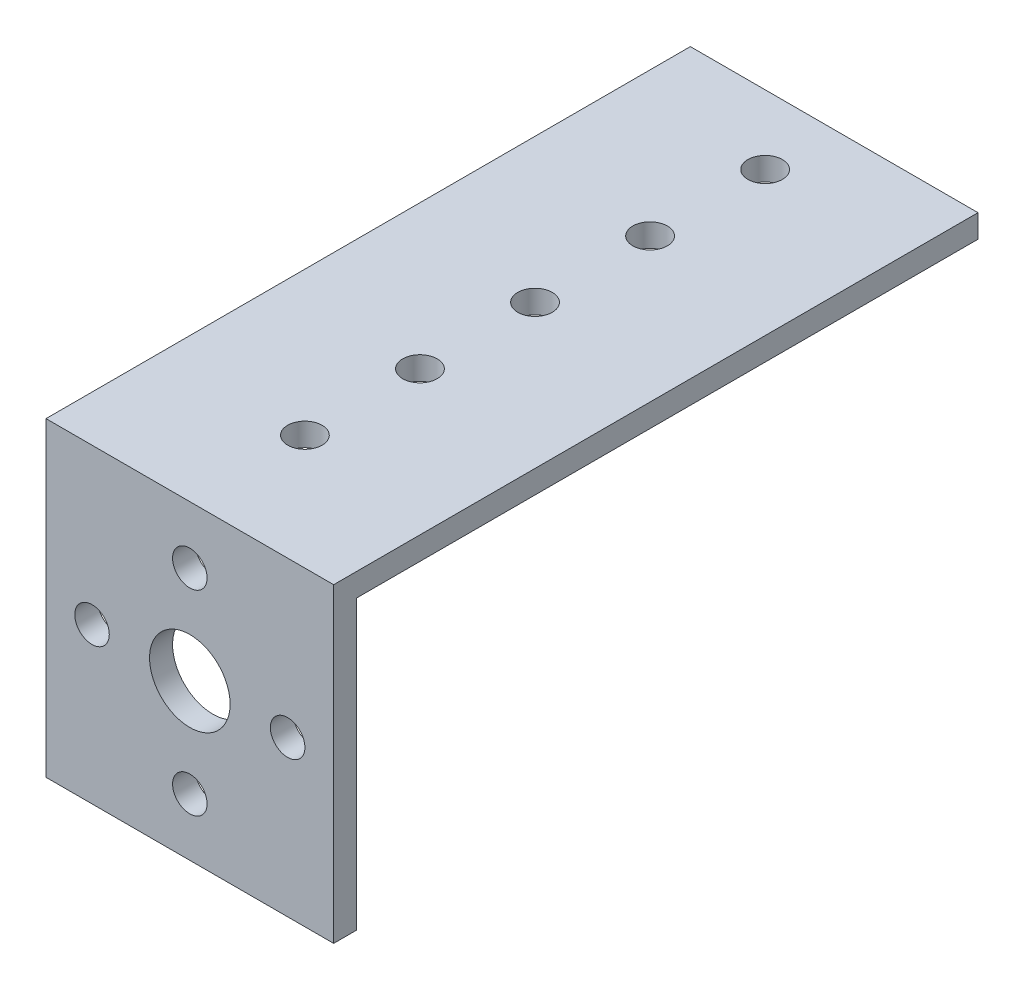
ISO-10303-21;
HEADER;
FILE_DESCRIPTION(('STEP AP214'),'2;1');
FILE_NAME('part.step','',(''),(''),'','','');
FILE_SCHEMA(('AUTOMOTIVE_DESIGN { 1 0 10303 214 1 1 1 1 }'));
ENDSEC;
DATA;
#1=APPLICATION_CONTEXT('core data for automotive mechanical design processes');
#2=APPLICATION_PROTOCOL_DEFINITION('international standard','automotive_design',2000,#1);
#3=PRODUCT_CONTEXT('',#1,'mechanical');
#4=PRODUCT('Part','Part','',(#3));
#5=PRODUCT_RELATED_PRODUCT_CATEGORY('part','',(#4));
#6=PRODUCT_DEFINITION_FORMATION('','',#4);
#7=PRODUCT_DEFINITION_CONTEXT('part definition',#1,'design');
#8=PRODUCT_DEFINITION('design','',#6,#7);
#9=PRODUCT_DEFINITION_SHAPE('','',#8);
#10=(LENGTH_UNIT() NAMED_UNIT(*) SI_UNIT(.MILLI.,.METRE.));
#11=(NAMED_UNIT(*) PLANE_ANGLE_UNIT() SI_UNIT($,.RADIAN.));
#12=(NAMED_UNIT(*) SI_UNIT($,.STERADIAN.) SOLID_ANGLE_UNIT());
#13=UNCERTAINTY_MEASURE_WITH_UNIT(LENGTH_MEASURE(1.E-05),#10,'distance_accuracy_value','');
#14=(GEOMETRIC_REPRESENTATION_CONTEXT(3) GLOBAL_UNCERTAINTY_ASSIGNED_CONTEXT((#13)) GLOBAL_UNIT_ASSIGNED_CONTEXT((#10,
#11,#12)) REPRESENTATION_CONTEXT('',''));
#15=CARTESIAN_POINT('',(0.,0.,0.));
#16=DIRECTION('',(0.,0.,1.));
#17=DIRECTION('',(1.,0.,0.));
#18=AXIS2_PLACEMENT_3D('',#15,#16,#17);
#19=CARTESIAN_POINT('',(25.,0.,-2.));
#20=DIRECTION('',(0.,1.,0.));
#21=DIRECTION('',(0.,0.,1.));
#22=AXIS2_PLACEMENT_3D('',#19,#20,#21);
#23=PLANE('',#22);
#24=DIRECTION('',(0.,0.,-1.));
#25=VECTOR('',#24,1.);
#26=CARTESIAN_POINT('',(0.,0.,-2.));
#27=LINE('',#26,#25);
#28=CARTESIAN_POINT('',(0.,0.,0.));
#29=VERTEX_POINT('',#28);
#30=CARTESIAN_POINT('',(0.,0.,-2.));
#31=VERTEX_POINT('',#30);
#32=EDGE_CURVE('E129',#29,#31,#27,.T.);
#33=ORIENTED_EDGE('',*,*,#32,.T.);
#34=DIRECTION('',(-1.,0.,0.));
#35=VECTOR('',#34,1.);
#36=CARTESIAN_POINT('',(25.,0.,-2.));
#37=LINE('',#36,#35);
#38=CARTESIAN_POINT('',(25.,0.,-2.));
#39=VERTEX_POINT('',#38);
#40=EDGE_CURVE('E11',#39,#31,#37,.T.);
#41=ORIENTED_EDGE('',*,*,#40,.F.);
#42=DIRECTION('',(0.,0.,-1.));
#43=VECTOR('',#42,1.);
#44=CARTESIAN_POINT('',(25.,0.,-2.));
#45=LINE('',#44,#43);
#46=CARTESIAN_POINT('',(25.,0.,0.));
#47=VERTEX_POINT('',#46);
#48=EDGE_CURVE('E140',#47,#39,#45,.T.);
#49=ORIENTED_EDGE('',*,*,#48,.F.);
#50=DIRECTION('',(-1.,0.,0.));
#51=VECTOR('',#50,1.);
#52=CARTESIAN_POINT('',(25.,0.,0.));
#53=LINE('',#52,#51);
#54=EDGE_CURVE('E125',#47,#29,#53,.T.);
#55=ORIENTED_EDGE('',*,*,#54,.T.);
#56=EDGE_LOOP('',(#33,#41,#49,#55));
#57=FACE_BOUND('',#56,.T.);
#58=ADVANCED_FACE('F45',(#57),#23,.F.);
#59=CARTESIAN_POINT('',(25.,25.,-2.));
#60=DIRECTION('',(0.,0.,1.));
#61=DIRECTION('',(0.,-1.,0.));
#62=AXIS2_PLACEMENT_3D('',#59,#60,#61);
#63=PLANE('',#62);
#64=CARTESIAN_POINT('',(12.5,22.,-2.));
#65=DIRECTION('',(0.,0.,1.));
#66=DIRECTION('',(0.,-1.,0.));
#67=AXIS2_PLACEMENT_3D('',#64,#65,#66);
#68=CIRCLE('',#67,1.5);
#69=CARTESIAN_POINT('',(12.5,20.5,-2.));
#70=VERTEX_POINT('',#69);
#71=EDGE_CURVE('E133',#70,#70,#68,.T.);
#72=ORIENTED_EDGE('',*,*,#71,.T.);
#73=EDGE_LOOP('',(#72));
#74=FACE_BOUND('',#73,.T.);
#75=CARTESIAN_POINT('',(12.5,5.00000000000001,-2.));
#76=DIRECTION('',(0.,0.,1.));
#77=DIRECTION('',(0.,-1.,0.));
#78=AXIS2_PLACEMENT_3D('',#75,#76,#77);
#79=CIRCLE('',#78,1.5);
#80=CARTESIAN_POINT('',(12.5,3.50000000000001,-2.));
#81=VERTEX_POINT('',#80);
#82=EDGE_CURVE('E315',#81,#81,#79,.T.);
#83=ORIENTED_EDGE('',*,*,#82,.T.);
#84=EDGE_LOOP('',(#83));
#85=FACE_BOUND('',#84,.T.);
#86=CARTESIAN_POINT('',(21.,13.5,-2.));
#87=DIRECTION('',(0.,0.,1.));
#88=DIRECTION('',(0.,-1.,0.));
#89=AXIS2_PLACEMENT_3D('',#86,#87,#88);
#90=CIRCLE('',#89,1.5);
#91=CARTESIAN_POINT('',(21.,12.,-2.));
#92=VERTEX_POINT('',#91);
#93=EDGE_CURVE('E312',#92,#92,#90,.T.);
#94=ORIENTED_EDGE('',*,*,#93,.T.);
#95=EDGE_LOOP('',(#94));
#96=FACE_BOUND('',#95,.T.);
#97=CARTESIAN_POINT('',(12.5,13.5,-2.));
#98=DIRECTION('',(0.,0.,1.));
#99=DIRECTION('',(0.,-1.,0.));
#100=AXIS2_PLACEMENT_3D('',#97,#98,#99);
#101=CIRCLE('',#100,3.5);
#102=CARTESIAN_POINT('',(12.5,10.,-2.));
#103=VERTEX_POINT('',#102);
#104=EDGE_CURVE('E309',#103,#103,#101,.T.);
#105=ORIENTED_EDGE('',*,*,#104,.T.);
#106=EDGE_LOOP('',(#105));
#107=FACE_BOUND('',#106,.T.);
#108=CARTESIAN_POINT('',(4.,13.5,-2.));
#109=DIRECTION('',(0.,0.,1.));
#110=DIRECTION('',(0.,-1.,0.));
#111=AXIS2_PLACEMENT_3D('',#108,#109,#110);
#112=CIRCLE('',#111,1.5);
#113=CARTESIAN_POINT('',(4.,12.,-2.));
#114=VERTEX_POINT('',#113);
#115=EDGE_CURVE('E298',#114,#114,#112,.T.);
#116=ORIENTED_EDGE('',*,*,#115,.T.);
#117=EDGE_LOOP('',(#116));
#118=FACE_BOUND('',#117,.T.);
#119=DIRECTION('',(0.,1.,0.));
#120=VECTOR('',#119,1.);
#121=CARTESIAN_POINT('',(0.,25.,-2.));
#122=LINE('',#121,#120);
#123=CARTESIAN_POINT('',(0.,25.,-2.));
#124=VERTEX_POINT('',#123);
#125=EDGE_CURVE('E132',#31,#124,#122,.T.);
#126=ORIENTED_EDGE('',*,*,#125,.T.);
#127=DIRECTION('',(-1.,0.,0.));
#128=VECTOR('',#127,1.);
#129=CARTESIAN_POINT('',(25.,25.,-2.));
#130=LINE('',#129,#128);
#131=CARTESIAN_POINT('',(25.,25.,-2.));
#132=VERTEX_POINT('',#131);
#133=EDGE_CURVE('E53',#132,#124,#130,.T.);
#134=ORIENTED_EDGE('',*,*,#133,.F.);
#135=DIRECTION('',(0.,1.,0.));
#136=VECTOR('',#135,1.);
#137=CARTESIAN_POINT('',(25.,25.,-2.));
#138=LINE('',#137,#136);
#139=EDGE_CURVE('E98',#39,#132,#138,.T.);
#140=ORIENTED_EDGE('',*,*,#139,.F.);
#141=ORIENTED_EDGE('',*,*,#40,.T.);
#142=EDGE_LOOP('',(#126,#134,#140,#141));
#143=FACE_BOUND('',#142,.T.);
#144=ADVANCED_FACE('F170',(#74,#85,#96,#107,#118,#143),#63,.F.);
#145=CARTESIAN_POINT('',(25.,25.,-56.));
#146=DIRECTION('',(0.,1.,0.));
#147=DIRECTION('',(0.,0.,1.));
#148=AXIS2_PLACEMENT_3D('',#145,#146,#147);
#149=PLANE('',#148);
#150=CARTESIAN_POINT('',(12.5,25.,-10.));
#151=DIRECTION('',(0.,1.,0.));
#152=DIRECTION('',(0.,0.,1.));
#153=AXIS2_PLACEMENT_3D('',#150,#151,#152);
#154=CIRCLE('',#153,1.5);
#155=CARTESIAN_POINT('',(12.5,25.,-8.5));
#156=VERTEX_POINT('',#155);
#157=EDGE_CURVE('E283',#156,#156,#154,.T.);
#158=ORIENTED_EDGE('',*,*,#157,.T.);
#159=EDGE_LOOP('',(#158));
#160=FACE_BOUND('',#159,.T.);
#161=CARTESIAN_POINT('',(12.5,25.,-20.));
#162=DIRECTION('',(0.,1.,0.));
#163=DIRECTION('',(0.,0.,1.));
#164=AXIS2_PLACEMENT_3D('',#161,#162,#163);
#165=CIRCLE('',#164,1.5);
#166=CARTESIAN_POINT('',(12.5,25.,-18.5));
#167=VERTEX_POINT('',#166);
#168=EDGE_CURVE('E285',#167,#167,#165,.T.);
#169=ORIENTED_EDGE('',*,*,#168,.T.);
#170=EDGE_LOOP('',(#169));
#171=FACE_BOUND('',#170,.T.);
#172=CARTESIAN_POINT('',(12.5,25.,-30.));
#173=DIRECTION('',(0.,1.,0.));
#174=DIRECTION('',(0.,0.,1.));
#175=AXIS2_PLACEMENT_3D('',#172,#173,#174);
#176=CIRCLE('',#175,1.5);
#177=CARTESIAN_POINT('',(12.5,25.,-28.5));
#178=VERTEX_POINT('',#177);
#179=EDGE_CURVE('E291',#178,#178,#176,.T.);
#180=ORIENTED_EDGE('',*,*,#179,.T.);
#181=EDGE_LOOP('',(#180));
#182=FACE_BOUND('',#181,.T.);
#183=CARTESIAN_POINT('',(12.5,25.,-40.));
#184=DIRECTION('',(0.,1.,0.));
#185=DIRECTION('',(0.,0.,1.));
#186=AXIS2_PLACEMENT_3D('',#183,#184,#185);
#187=CIRCLE('',#186,1.5);
#188=CARTESIAN_POINT('',(12.5,25.,-38.5));
#189=VERTEX_POINT('',#188);
#190=EDGE_CURVE('E341',#189,#189,#187,.T.);
#191=ORIENTED_EDGE('',*,*,#190,.T.);
#192=EDGE_LOOP('',(#191));
#193=FACE_BOUND('',#192,.T.);
#194=CARTESIAN_POINT('',(12.5,25.,-50.));
#195=DIRECTION('',(0.,1.,0.));
#196=DIRECTION('',(0.,0.,1.));
#197=AXIS2_PLACEMENT_3D('',#194,#195,#196);
#198=CIRCLE('',#197,1.5);
#199=CARTESIAN_POINT('',(12.5,25.,-48.5));
#200=VERTEX_POINT('',#199);
#201=EDGE_CURVE('E344',#200,#200,#198,.T.);
#202=ORIENTED_EDGE('',*,*,#201,.T.);
#203=EDGE_LOOP('',(#202));
#204=FACE_BOUND('',#203,.T.);
#205=DIRECTION('',(0.,0.,-1.));
#206=VECTOR('',#205,1.);
#207=CARTESIAN_POINT('',(0.,25.,-56.));
#208=LINE('',#207,#206);
#209=CARTESIAN_POINT('',(0.,25.,-56.));
#210=VERTEX_POINT('',#209);
#211=EDGE_CURVE('E135',#124,#210,#208,.T.);
#212=ORIENTED_EDGE('',*,*,#211,.T.);
#213=DIRECTION('',(-1.,0.,0.));
#214=VECTOR('',#213,1.);
#215=CARTESIAN_POINT('',(25.,25.,-56.));
#216=LINE('',#215,#214);
#217=CARTESIAN_POINT('',(25.,25.,-56.));
#218=VERTEX_POINT('',#217);
#219=EDGE_CURVE('E120',#218,#210,#216,.T.);
#220=ORIENTED_EDGE('',*,*,#219,.F.);
#221=DIRECTION('',(0.,0.,-1.));
#222=VECTOR('',#221,1.);
#223=CARTESIAN_POINT('',(25.,25.,-56.));
#224=LINE('',#223,#222);
#225=EDGE_CURVE('E111',#132,#218,#224,.T.);
#226=ORIENTED_EDGE('',*,*,#225,.F.);
#227=ORIENTED_EDGE('',*,*,#133,.T.);
#228=EDGE_LOOP('',(#212,#220,#226,#227));
#229=FACE_BOUND('',#228,.T.);
#230=ADVANCED_FACE('F146',(#160,#171,#182,#193,#204,#229),#149,.F.);
#231=CARTESIAN_POINT('',(25.,27.,-56.));
#232=DIRECTION('',(0.,0.,1.));
#233=DIRECTION('',(1.,0.,0.));
#234=AXIS2_PLACEMENT_3D('',#231,#232,#233);
#235=PLANE('',#234);
#236=DIRECTION('',(0.,1.,0.));
#237=VECTOR('',#236,1.);
#238=CARTESIAN_POINT('',(0.,27.,-56.));
#239=LINE('',#238,#237);
#240=CARTESIAN_POINT('',(0.,27.,-56.));
#241=VERTEX_POINT('',#240);
#242=EDGE_CURVE('E119',#210,#241,#239,.T.);
#243=ORIENTED_EDGE('',*,*,#242,.T.);
#244=DIRECTION('',(-1.,0.,0.));
#245=VECTOR('',#244,1.);
#246=CARTESIAN_POINT('',(25.,27.,-56.));
#247=LINE('',#246,#245);
#248=CARTESIAN_POINT('',(25.,27.,-56.));
#249=VERTEX_POINT('',#248);
#250=EDGE_CURVE('E116',#249,#241,#247,.T.);
#251=ORIENTED_EDGE('',*,*,#250,.F.);
#252=DIRECTION('',(0.,1.,0.));
#253=VECTOR('',#252,1.);
#254=CARTESIAN_POINT('',(25.,27.,-56.));
#255=LINE('',#254,#253);
#256=EDGE_CURVE('E105',#218,#249,#255,.T.);
#257=ORIENTED_EDGE('',*,*,#256,.F.);
#258=ORIENTED_EDGE('',*,*,#219,.T.);
#259=EDGE_LOOP('',(#243,#251,#257,#258));
#260=FACE_BOUND('',#259,.T.);
#261=ADVANCED_FACE('F117',(#260),#235,.F.);
#262=CARTESIAN_POINT('',(25.,27.,0.));
#263=DIRECTION('',(0.,-1.,0.));
#264=DIRECTION('',(0.,0.,-1.));
#265=AXIS2_PLACEMENT_3D('',#262,#263,#264);
#266=PLANE('',#265);
#267=CARTESIAN_POINT('',(12.5,27.,-10.));
#268=DIRECTION('',(0.,1.,0.));
#269=DIRECTION('',(0.,0.,1.));
#270=AXIS2_PLACEMENT_3D('',#267,#268,#269);
#271=CIRCLE('',#270,1.5);
#272=CARTESIAN_POINT('',(12.5,27.,-8.5));
#273=VERTEX_POINT('',#272);
#274=EDGE_CURVE('E280',#273,#273,#271,.T.);
#275=ORIENTED_EDGE('',*,*,#274,.F.);
#276=EDGE_LOOP('',(#275));
#277=FACE_BOUND('',#276,.T.);
#278=CARTESIAN_POINT('',(12.5,27.,-20.));
#279=DIRECTION('',(0.,1.,0.));
#280=DIRECTION('',(0.,0.,1.));
#281=AXIS2_PLACEMENT_3D('',#278,#279,#280);
#282=CIRCLE('',#281,1.5);
#283=CARTESIAN_POINT('',(12.5,27.,-18.5));
#284=VERTEX_POINT('',#283);
#285=EDGE_CURVE('E356',#284,#284,#282,.T.);
#286=ORIENTED_EDGE('',*,*,#285,.F.);
#287=EDGE_LOOP('',(#286));
#288=FACE_BOUND('',#287,.T.);
#289=CARTESIAN_POINT('',(12.5,27.,-30.));
#290=DIRECTION('',(0.,1.,0.));
#291=DIRECTION('',(0.,0.,1.));
#292=AXIS2_PLACEMENT_3D('',#289,#290,#291);
#293=CIRCLE('',#292,1.5);
#294=CARTESIAN_POINT('',(12.5,27.,-28.5));
#295=VERTEX_POINT('',#294);
#296=EDGE_CURVE('E353',#295,#295,#293,.T.);
#297=ORIENTED_EDGE('',*,*,#296,.F.);
#298=EDGE_LOOP('',(#297));
#299=FACE_BOUND('',#298,.T.);
#300=CARTESIAN_POINT('',(12.5,27.,-40.));
#301=DIRECTION('',(0.,1.,0.));
#302=DIRECTION('',(0.,0.,1.));
#303=AXIS2_PLACEMENT_3D('',#300,#301,#302);
#304=CIRCLE('',#303,1.5);
#305=CARTESIAN_POINT('',(12.5,27.,-38.5));
#306=VERTEX_POINT('',#305);
#307=EDGE_CURVE('E350',#306,#306,#304,.T.);
#308=ORIENTED_EDGE('',*,*,#307,.F.);
#309=EDGE_LOOP('',(#308));
#310=FACE_BOUND('',#309,.T.);
#311=CARTESIAN_POINT('',(12.5,27.,-50.));
#312=DIRECTION('',(0.,1.,0.));
#313=DIRECTION('',(0.,0.,1.));
#314=AXIS2_PLACEMENT_3D('',#311,#312,#313);
#315=CIRCLE('',#314,1.5);
#316=CARTESIAN_POINT('',(12.5,27.,-48.5));
#317=VERTEX_POINT('',#316);
#318=EDGE_CURVE('E347',#317,#317,#315,.T.);
#319=ORIENTED_EDGE('',*,*,#318,.F.);
#320=EDGE_LOOP('',(#319));
#321=FACE_BOUND('',#320,.T.);
#322=DIRECTION('',(0.,0.,1.));
#323=VECTOR('',#322,1.);
#324=CARTESIAN_POINT('',(0.,27.,0.));
#325=LINE('',#324,#323);
#326=CARTESIAN_POINT('',(0.,27.,0.));
#327=VERTEX_POINT('',#326);
#328=EDGE_CURVE('E84',#241,#327,#325,.T.);
#329=ORIENTED_EDGE('',*,*,#328,.T.);
#330=DIRECTION('',(-1.,0.,0.));
#331=VECTOR('',#330,1.);
#332=CARTESIAN_POINT('',(25.,27.,0.));
#333=LINE('',#332,#331);
#334=CARTESIAN_POINT('',(25.,27.,0.));
#335=VERTEX_POINT('',#334);
#336=EDGE_CURVE('E121',#335,#327,#333,.T.);
#337=ORIENTED_EDGE('',*,*,#336,.F.);
#338=DIRECTION('',(0.,0.,1.));
#339=VECTOR('',#338,1.);
#340=CARTESIAN_POINT('',(25.,27.,0.));
#341=LINE('',#340,#339);
#342=EDGE_CURVE('E109',#249,#335,#341,.T.);
#343=ORIENTED_EDGE('',*,*,#342,.F.);
#344=ORIENTED_EDGE('',*,*,#250,.T.);
#345=EDGE_LOOP('',(#329,#337,#343,#344));
#346=FACE_BOUND('',#345,.T.);
#347=ADVANCED_FACE('F123',(#277,#288,#299,#310,#321,#346),#266,.F.);
#348=CARTESIAN_POINT('',(25.,0.,0.));
#349=DIRECTION('',(0.,0.,-1.));
#350=DIRECTION('',(-1.,0.,0.));
#351=AXIS2_PLACEMENT_3D('',#348,#349,#350);
#352=PLANE('',#351);
#353=CARTESIAN_POINT('',(12.5,22.,0.));
#354=DIRECTION('',(0.,0.,1.));
#355=DIRECTION('',(1.,0.,0.));
#356=AXIS2_PLACEMENT_3D('',#353,#354,#355);
#357=CIRCLE('',#356,1.5);
#358=CARTESIAN_POINT('',(14.,22.,0.));
#359=VERTEX_POINT('',#358);
#360=EDGE_CURVE('E295',#359,#359,#357,.T.);
#361=ORIENTED_EDGE('',*,*,#360,.F.);
#362=EDGE_LOOP('',(#361));
#363=FACE_BOUND('',#362,.T.);
#364=CARTESIAN_POINT('',(12.5,5.00000000000001,0.));
#365=DIRECTION('',(0.,0.,1.));
#366=DIRECTION('',(1.,0.,0.));
#367=AXIS2_PLACEMENT_3D('',#364,#365,#366);
#368=CIRCLE('',#367,1.5);
#369=CARTESIAN_POINT('',(14.,5.00000000000001,0.));
#370=VERTEX_POINT('',#369);
#371=EDGE_CURVE('E284',#370,#370,#368,.T.);
#372=ORIENTED_EDGE('',*,*,#371,.F.);
#373=EDGE_LOOP('',(#372));
#374=FACE_BOUND('',#373,.T.);
#375=CARTESIAN_POINT('',(21.,13.5,0.));
#376=DIRECTION('',(0.,0.,1.));
#377=DIRECTION('',(1.,0.,0.));
#378=AXIS2_PLACEMENT_3D('',#375,#376,#377);
#379=CIRCLE('',#378,1.5);
#380=CARTESIAN_POINT('',(22.5,13.5,0.));
#381=VERTEX_POINT('',#380);
#382=EDGE_CURVE('E288',#381,#381,#379,.T.);
#383=ORIENTED_EDGE('',*,*,#382,.F.);
#384=EDGE_LOOP('',(#383));
#385=FACE_BOUND('',#384,.T.);
#386=CARTESIAN_POINT('',(12.5,13.5,0.));
#387=DIRECTION('',(0.,0.,1.));
#388=DIRECTION('',(1.,0.,0.));
#389=AXIS2_PLACEMENT_3D('',#386,#387,#388);
#390=CIRCLE('',#389,3.5);
#391=CARTESIAN_POINT('',(16.,13.5,0.));
#392=VERTEX_POINT('',#391);
#393=EDGE_CURVE('E301',#392,#392,#390,.T.);
#394=ORIENTED_EDGE('',*,*,#393,.F.);
#395=EDGE_LOOP('',(#394));
#396=FACE_BOUND('',#395,.T.);
#397=CARTESIAN_POINT('',(4.,13.5,0.));
#398=DIRECTION('',(0.,0.,1.));
#399=DIRECTION('',(1.,0.,0.));
#400=AXIS2_PLACEMENT_3D('',#397,#398,#399);
#401=CIRCLE('',#400,1.5);
#402=CARTESIAN_POINT('',(5.5,13.5,0.));
#403=VERTEX_POINT('',#402);
#404=EDGE_CURVE('E299',#403,#403,#401,.T.);
#405=ORIENTED_EDGE('',*,*,#404,.F.);
#406=EDGE_LOOP('',(#405));
#407=FACE_BOUND('',#406,.T.);
#408=DIRECTION('',(0.,-1.,0.));
#409=VECTOR('',#408,1.);
#410=CARTESIAN_POINT('',(0.,0.,0.));
#411=LINE('',#410,#409);
#412=EDGE_CURVE('E90',#327,#29,#411,.T.);
#413=ORIENTED_EDGE('',*,*,#412,.T.);
#414=ORIENTED_EDGE('',*,*,#54,.F.);
#415=DIRECTION('',(0.,-1.,0.));
#416=VECTOR('',#415,1.);
#417=CARTESIAN_POINT('',(25.,0.,0.));
#418=LINE('',#417,#416);
#419=EDGE_CURVE('E61',#335,#47,#418,.T.);
#420=ORIENTED_EDGE('',*,*,#419,.F.);
#421=ORIENTED_EDGE('',*,*,#336,.T.);
#422=EDGE_LOOP('',(#413,#414,#420,#421));
#423=FACE_BOUND('',#422,.T.);
#424=ADVANCED_FACE('F153',(#363,#374,#385,#396,#407,#423),#352,.F.);
#425=CARTESIAN_POINT('',(25.,0.,0.));
#426=DIRECTION('',(-1.,0.,0.));
#427=DIRECTION('',(0.,0.,1.));
#428=AXIS2_PLACEMENT_3D('',#425,#426,#427);
#429=PLANE('',#428);
#430=ORIENTED_EDGE('',*,*,#48,.T.);
#431=ORIENTED_EDGE('',*,*,#139,.T.);
#432=ORIENTED_EDGE('',*,*,#225,.T.);
#433=ORIENTED_EDGE('',*,*,#256,.T.);
#434=ORIENTED_EDGE('',*,*,#342,.T.);
#435=ORIENTED_EDGE('',*,*,#419,.T.);
#436=EDGE_LOOP('',(#430,#431,#432,#433,#434,#435));
#437=FACE_BOUND('',#436,.T.);
#438=ADVANCED_FACE('F107',(#437),#429,.F.);
#439=CARTESIAN_POINT('',(0.,0.,0.));
#440=DIRECTION('',(-1.,0.,0.));
#441=DIRECTION('',(0.,0.,1.));
#442=AXIS2_PLACEMENT_3D('',#439,#440,#441);
#443=PLANE('',#442);
#444=ORIENTED_EDGE('',*,*,#32,.F.);
#445=ORIENTED_EDGE('',*,*,#412,.F.);
#446=ORIENTED_EDGE('',*,*,#328,.F.);
#447=ORIENTED_EDGE('',*,*,#242,.F.);
#448=ORIENTED_EDGE('',*,*,#211,.F.);
#449=ORIENTED_EDGE('',*,*,#125,.F.);
#450=EDGE_LOOP('',(#444,#445,#446,#447,#448,#449));
#451=FACE_BOUND('',#450,.T.);
#452=ADVANCED_FACE('F149',(#451),#443,.T.);
#453=CARTESIAN_POINT('',(4.,13.5,-25.));
#454=DIRECTION('',(0.,0.,1.));
#455=DIRECTION('',(1.,0.,0.));
#456=AXIS2_PLACEMENT_3D('',#453,#454,#455);
#457=CYLINDRICAL_SURFACE('',#456,1.5);
#458=ORIENTED_EDGE('',*,*,#404,.T.);
#459=EDGE_LOOP('',(#458));
#460=FACE_BOUND('',#459,.T.);
#461=ORIENTED_EDGE('',*,*,#115,.F.);
#462=EDGE_LOOP('',(#461));
#463=FACE_BOUND('',#462,.T.);
#464=ADVANCED_FACE('F196',(#460,#463),#457,.F.);
#465=CARTESIAN_POINT('',(12.5,13.5,-25.));
#466=DIRECTION('',(0.,0.,1.));
#467=DIRECTION('',(1.,0.,0.));
#468=AXIS2_PLACEMENT_3D('',#465,#466,#467);
#469=CYLINDRICAL_SURFACE('',#468,3.5);
#470=ORIENTED_EDGE('',*,*,#393,.T.);
#471=EDGE_LOOP('',(#470));
#472=FACE_BOUND('',#471,.T.);
#473=ORIENTED_EDGE('',*,*,#104,.F.);
#474=EDGE_LOOP('',(#473));
#475=FACE_BOUND('',#474,.T.);
#476=ADVANCED_FACE('F203',(#472,#475),#469,.F.);
#477=CARTESIAN_POINT('',(21.,13.5,-25.));
#478=DIRECTION('',(0.,0.,1.));
#479=DIRECTION('',(1.,0.,0.));
#480=AXIS2_PLACEMENT_3D('',#477,#478,#479);
#481=CYLINDRICAL_SURFACE('',#480,1.5);
#482=ORIENTED_EDGE('',*,*,#382,.T.);
#483=EDGE_LOOP('',(#482));
#484=FACE_BOUND('',#483,.T.);
#485=ORIENTED_EDGE('',*,*,#93,.F.);
#486=EDGE_LOOP('',(#485));
#487=FACE_BOUND('',#486,.T.);
#488=ADVANCED_FACE('F211',(#484,#487),#481,.F.);
#489=CARTESIAN_POINT('',(12.5,5.00000000000001,-25.));
#490=DIRECTION('',(0.,0.,1.));
#491=DIRECTION('',(1.,0.,0.));
#492=AXIS2_PLACEMENT_3D('',#489,#490,#491);
#493=CYLINDRICAL_SURFACE('',#492,1.5);
#494=ORIENTED_EDGE('',*,*,#371,.T.);
#495=EDGE_LOOP('',(#494));
#496=FACE_BOUND('',#495,.T.);
#497=ORIENTED_EDGE('',*,*,#82,.F.);
#498=EDGE_LOOP('',(#497));
#499=FACE_BOUND('',#498,.T.);
#500=ADVANCED_FACE('F219',(#496,#499),#493,.F.);
#501=CARTESIAN_POINT('',(12.5,22.,-25.));
#502=DIRECTION('',(0.,0.,1.));
#503=DIRECTION('',(1.,0.,0.));
#504=AXIS2_PLACEMENT_3D('',#501,#502,#503);
#505=CYLINDRICAL_SURFACE('',#504,1.5);
#506=ORIENTED_EDGE('',*,*,#360,.T.);
#507=EDGE_LOOP('',(#506));
#508=FACE_BOUND('',#507,.T.);
#509=ORIENTED_EDGE('',*,*,#71,.F.);
#510=EDGE_LOOP('',(#509));
#511=FACE_BOUND('',#510,.T.);
#512=ADVANCED_FACE('F227',(#508,#511),#505,.F.);
#513=CARTESIAN_POINT('',(12.5,2.00000000000001,-50.));
#514=DIRECTION('',(0.,1.,0.));
#515=DIRECTION('',(0.,0.,1.));
#516=AXIS2_PLACEMENT_3D('',#513,#514,#515);
#517=CYLINDRICAL_SURFACE('',#516,1.5);
#518=ORIENTED_EDGE('',*,*,#318,.T.);
#519=EDGE_LOOP('',(#518));
#520=FACE_BOUND('',#519,.T.);
#521=ORIENTED_EDGE('',*,*,#201,.F.);
#522=EDGE_LOOP('',(#521));
#523=FACE_BOUND('',#522,.T.);
#524=ADVANCED_FACE('F235',(#520,#523),#517,.F.);
#525=CARTESIAN_POINT('',(12.5,2.00000000000001,-40.));
#526=DIRECTION('',(0.,1.,0.));
#527=DIRECTION('',(0.,0.,1.));
#528=AXIS2_PLACEMENT_3D('',#525,#526,#527);
#529=CYLINDRICAL_SURFACE('',#528,1.5);
#530=ORIENTED_EDGE('',*,*,#307,.T.);
#531=EDGE_LOOP('',(#530));
#532=FACE_BOUND('',#531,.T.);
#533=ORIENTED_EDGE('',*,*,#190,.F.);
#534=EDGE_LOOP('',(#533));
#535=FACE_BOUND('',#534,.T.);
#536=ADVANCED_FACE('F243',(#532,#535),#529,.F.);
#537=CARTESIAN_POINT('',(12.5,2.00000000000001,-30.));
#538=DIRECTION('',(0.,1.,0.));
#539=DIRECTION('',(0.,0.,1.));
#540=AXIS2_PLACEMENT_3D('',#537,#538,#539);
#541=CYLINDRICAL_SURFACE('',#540,1.5);
#542=ORIENTED_EDGE('',*,*,#296,.T.);
#543=EDGE_LOOP('',(#542));
#544=FACE_BOUND('',#543,.T.);
#545=ORIENTED_EDGE('',*,*,#179,.F.);
#546=EDGE_LOOP('',(#545));
#547=FACE_BOUND('',#546,.T.);
#548=ADVANCED_FACE('F251',(#544,#547),#541,.F.);
#549=CARTESIAN_POINT('',(12.5,2.00000000000001,-20.));
#550=DIRECTION('',(0.,1.,0.));
#551=DIRECTION('',(0.,0.,1.));
#552=AXIS2_PLACEMENT_3D('',#549,#550,#551);
#553=CYLINDRICAL_SURFACE('',#552,1.5);
#554=ORIENTED_EDGE('',*,*,#285,.T.);
#555=EDGE_LOOP('',(#554));
#556=FACE_BOUND('',#555,.T.);
#557=ORIENTED_EDGE('',*,*,#168,.F.);
#558=EDGE_LOOP('',(#557));
#559=FACE_BOUND('',#558,.T.);
#560=ADVANCED_FACE('F259',(#556,#559),#553,.F.);
#561=CARTESIAN_POINT('',(12.5,2.00000000000001,-10.));
#562=DIRECTION('',(0.,1.,0.));
#563=DIRECTION('',(0.,0.,1.));
#564=AXIS2_PLACEMENT_3D('',#561,#562,#563);
#565=CYLINDRICAL_SURFACE('',#564,1.5);
#566=ORIENTED_EDGE('',*,*,#274,.T.);
#567=EDGE_LOOP('',(#566));
#568=FACE_BOUND('',#567,.T.);
#569=ORIENTED_EDGE('',*,*,#157,.F.);
#570=EDGE_LOOP('',(#569));
#571=FACE_BOUND('',#570,.T.);
#572=ADVANCED_FACE('F267',(#568,#571),#565,.F.);
#573=CLOSED_SHELL('',(#58,#144,#230,#261,#347,#424,#438,#452,#464,#476,#488,#500,#512,#524,#536,
#548,#560,#572));
#574=MANIFOLD_SOLID_BREP('B2',#573);
#575=ADVANCED_BREP_SHAPE_REPRESENTATION('',(#18,#574),#14);
#576=SHAPE_DEFINITION_REPRESENTATION(#9,#575);
ENDSEC;
END-ISO-10303-21;
